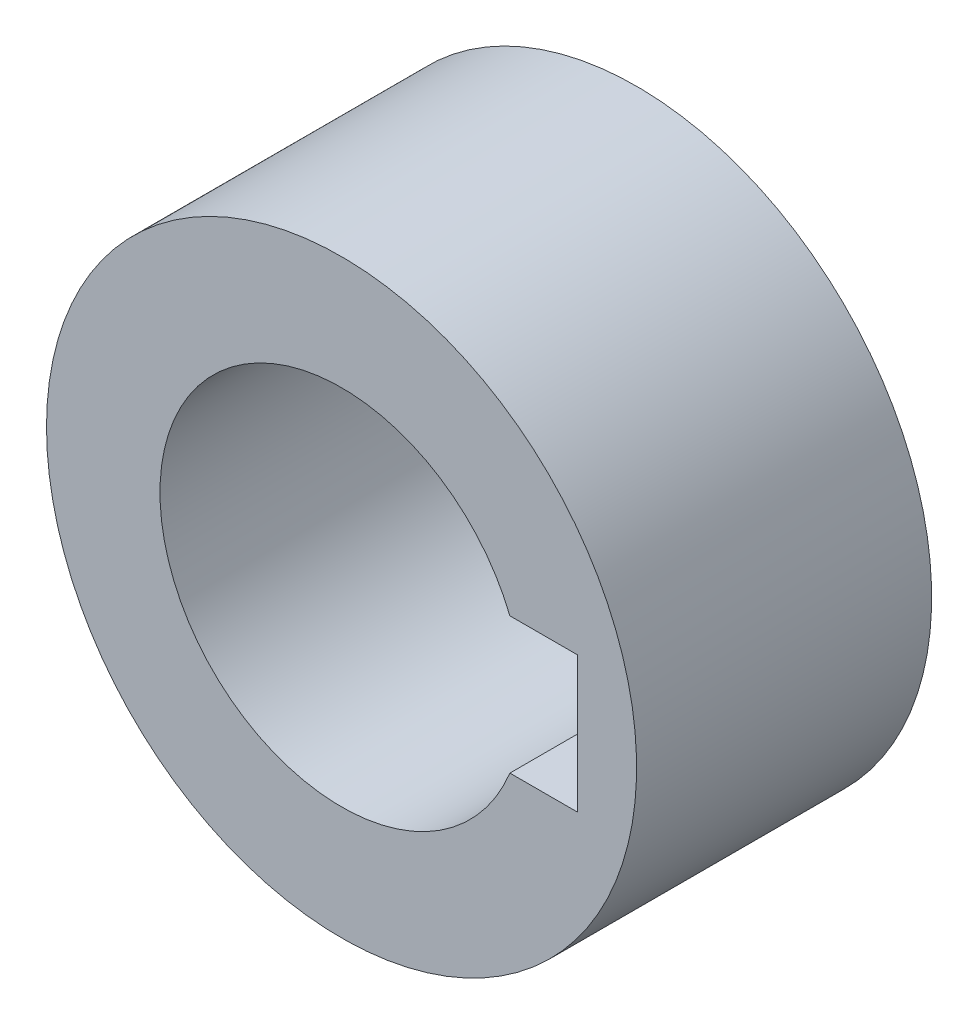
ISO-10303-21;
HEADER;
FILE_DESCRIPTION(('STEP AP214'),'2;1');
FILE_NAME('part.step','',(''),(''),'','','');
FILE_SCHEMA(('AUTOMOTIVE_DESIGN { 1 0 10303 214 1 1 1 1 }'));
ENDSEC;
DATA;
#1=APPLICATION_CONTEXT('core data for automotive mechanical design processes');
#2=APPLICATION_PROTOCOL_DEFINITION('international standard','automotive_design',2000,#1);
#3=PRODUCT_CONTEXT('',#1,'mechanical');
#4=PRODUCT('Part','Part','',(#3));
#5=PRODUCT_RELATED_PRODUCT_CATEGORY('part','',(#4));
#6=PRODUCT_DEFINITION_FORMATION('','',#4);
#7=PRODUCT_DEFINITION_CONTEXT('part definition',#1,'design');
#8=PRODUCT_DEFINITION('design','',#6,#7);
#9=PRODUCT_DEFINITION_SHAPE('','',#8);
#10=(LENGTH_UNIT() NAMED_UNIT(*) SI_UNIT(.MILLI.,.METRE.));
#11=(NAMED_UNIT(*) PLANE_ANGLE_UNIT() SI_UNIT($,.RADIAN.));
#12=(NAMED_UNIT(*) SI_UNIT($,.STERADIAN.) SOLID_ANGLE_UNIT());
#13=UNCERTAINTY_MEASURE_WITH_UNIT(LENGTH_MEASURE(1.E-05),#10,'distance_accuracy_value','');
#14=(GEOMETRIC_REPRESENTATION_CONTEXT(3) GLOBAL_UNCERTAINTY_ASSIGNED_CONTEXT((#13)) GLOBAL_UNIT_ASSIGNED_CONTEXT((#10,
#11,#12)) REPRESENTATION_CONTEXT('',''));
#15=CARTESIAN_POINT('',(0.,0.,0.));
#16=DIRECTION('',(0.,0.,1.));
#17=DIRECTION('',(1.,0.,0.));
#18=AXIS2_PLACEMENT_3D('',#15,#16,#17);
#19=CARTESIAN_POINT('',(0.,0.,6.5));
#20=DIRECTION('',(0.,0.,-1.));
#21=DIRECTION('',(-1.,0.,0.));
#22=AXIS2_PLACEMENT_3D('',#19,#20,#21);
#23=CYLINDRICAL_SURFACE('',#22,4.);
#24=CARTESIAN_POINT('',(0.,0.,0.));
#25=DIRECTION('',(0.,0.,1.));
#26=DIRECTION('',(1.,0.,0.));
#27=AXIS2_PLACEMENT_3D('',#24,#25,#26);
#28=CIRCLE('',#27,4.);
#29=CARTESIAN_POINT('',(3.70809924354783,1.5,0.));
#30=VERTEX_POINT('',#29);
#31=CARTESIAN_POINT('',(3.70809924354783,-1.5,0.));
#32=VERTEX_POINT('',#31);
#33=EDGE_CURVE('E108',#30,#32,#28,.T.);
#34=ORIENTED_EDGE('',*,*,#33,.F.);
#35=DIRECTION('',(0.,0.,-1.));
#36=VECTOR('',#35,1.);
#37=CARTESIAN_POINT('',(3.70809924354783,1.5,6.5));
#38=LINE('',#37,#36);
#39=CARTESIAN_POINT('',(3.70809924354783,1.5,6.5));
#40=VERTEX_POINT('',#39);
#41=EDGE_CURVE('E11',#40,#30,#38,.T.);
#42=ORIENTED_EDGE('',*,*,#41,.F.);
#43=CARTESIAN_POINT('',(0.,0.,6.5));
#44=DIRECTION('',(0.,0.,1.));
#45=DIRECTION('',(1.,0.,0.));
#46=AXIS2_PLACEMENT_3D('',#43,#44,#45);
#47=CIRCLE('',#46,4.);
#48=CARTESIAN_POINT('',(3.70809924354783,-1.5,6.5));
#49=VERTEX_POINT('',#48);
#50=EDGE_CURVE('E90',#40,#49,#47,.T.);
#51=ORIENTED_EDGE('',*,*,#50,.T.);
#52=DIRECTION('',(0.,0.,-1.));
#53=VECTOR('',#52,1.);
#54=CARTESIAN_POINT('',(3.70809924354783,-1.5,6.5));
#55=LINE('',#54,#53);
#56=EDGE_CURVE('E57',#49,#32,#55,.T.);
#57=ORIENTED_EDGE('',*,*,#56,.T.);
#58=EDGE_LOOP('',(#34,#42,#51,#57));
#59=FACE_BOUND('',#58,.T.);
#60=ADVANCED_FACE('F41',(#59),#23,.F.);
#61=CARTESIAN_POINT('',(0.,1.5,6.5));
#62=DIRECTION('',(0.,1.,0.));
#63=DIRECTION('',(0.,0.,1.));
#64=AXIS2_PLACEMENT_3D('',#61,#62,#63);
#65=PLANE('',#64);
#66=DIRECTION('',(1.,0.,0.));
#67=VECTOR('',#66,1.);
#68=CARTESIAN_POINT('',(0.,1.5,0.));
#69=LINE('',#68,#67);
#70=CARTESIAN_POINT('',(5.2,1.5,0.));
#71=VERTEX_POINT('',#70);
#72=EDGE_CURVE('E96',#30,#71,#69,.T.);
#73=ORIENTED_EDGE('',*,*,#72,.T.);
#74=DIRECTION('',(0.,0.,-1.));
#75=VECTOR('',#74,1.);
#76=CARTESIAN_POINT('',(5.2,1.5,6.5));
#77=LINE('',#76,#75);
#78=CARTESIAN_POINT('',(5.2,1.5,6.5));
#79=VERTEX_POINT('',#78);
#80=EDGE_CURVE('E49',#79,#71,#77,.T.);
#81=ORIENTED_EDGE('',*,*,#80,.F.);
#82=DIRECTION('',(1.,0.,0.));
#83=VECTOR('',#82,1.);
#84=CARTESIAN_POINT('',(0.,1.5,6.5));
#85=LINE('',#84,#83);
#86=EDGE_CURVE('E83',#40,#79,#85,.T.);
#87=ORIENTED_EDGE('',*,*,#86,.F.);
#88=ORIENTED_EDGE('',*,*,#41,.T.);
#89=EDGE_LOOP('',(#73,#81,#87,#88));
#90=FACE_BOUND('',#89,.T.);
#91=ADVANCED_FACE('F94',(#90),#65,.F.);
#92=CARTESIAN_POINT('',(5.2,0.,6.5));
#93=DIRECTION('',(-1.,0.,0.));
#94=DIRECTION('',(0.,0.,1.));
#95=AXIS2_PLACEMENT_3D('',#92,#93,#94);
#96=PLANE('',#95);
#97=DIRECTION('',(0.,1.,0.));
#98=VECTOR('',#97,1.);
#99=CARTESIAN_POINT('',(5.2,0.,0.));
#100=LINE('',#99,#98);
#101=CARTESIAN_POINT('',(5.2,-1.5,0.));
#102=VERTEX_POINT('',#101);
#103=EDGE_CURVE('E111',#102,#71,#100,.T.);
#104=ORIENTED_EDGE('',*,*,#103,.F.);
#105=DIRECTION('',(0.,0.,-1.));
#106=VECTOR('',#105,1.);
#107=CARTESIAN_POINT('',(5.2,-1.5,6.5));
#108=LINE('',#107,#106);
#109=CARTESIAN_POINT('',(5.2,-1.5,6.5));
#110=VERTEX_POINT('',#109);
#111=EDGE_CURVE('E70',#110,#102,#108,.T.);
#112=ORIENTED_EDGE('',*,*,#111,.F.);
#113=DIRECTION('',(0.,1.,0.));
#114=VECTOR('',#113,1.);
#115=CARTESIAN_POINT('',(5.2,0.,6.5));
#116=LINE('',#115,#114);
#117=EDGE_CURVE('E89',#110,#79,#116,.T.);
#118=ORIENTED_EDGE('',*,*,#117,.T.);
#119=ORIENTED_EDGE('',*,*,#80,.T.);
#120=EDGE_LOOP('',(#104,#112,#118,#119));
#121=FACE_BOUND('',#120,.T.);
#122=ADVANCED_FACE('F99',(#121),#96,.T.);
#123=CARTESIAN_POINT('',(0.,-1.5,6.5));
#124=DIRECTION('',(0.,1.,0.));
#125=DIRECTION('',(-1.,0.,0.));
#126=AXIS2_PLACEMENT_3D('',#123,#124,#125);
#127=PLANE('',#126);
#128=DIRECTION('',(1.,0.,0.));
#129=VECTOR('',#128,1.);
#130=CARTESIAN_POINT('',(0.,-1.5,0.));
#131=LINE('',#130,#129);
#132=EDGE_CURVE('E113',#32,#102,#131,.T.);
#133=ORIENTED_EDGE('',*,*,#132,.F.);
#134=ORIENTED_EDGE('',*,*,#56,.F.);
#135=DIRECTION('',(1.,0.,0.));
#136=VECTOR('',#135,1.);
#137=CARTESIAN_POINT('',(0.,-1.5,6.5));
#138=LINE('',#137,#136);
#139=EDGE_CURVE('E100',#49,#110,#138,.T.);
#140=ORIENTED_EDGE('',*,*,#139,.T.);
#141=ORIENTED_EDGE('',*,*,#111,.T.);
#142=EDGE_LOOP('',(#133,#134,#140,#141));
#143=FACE_BOUND('',#142,.T.);
#144=ADVANCED_FACE('F122',(#143),#127,.T.);
#145=CARTESIAN_POINT('',(0.,0.,6.5));
#146=DIRECTION('',(0.,0.,-1.));
#147=DIRECTION('',(-1.,0.,0.));
#148=AXIS2_PLACEMENT_3D('',#145,#146,#147);
#149=CYLINDRICAL_SURFACE('',#148,6.5);
#150=CARTESIAN_POINT('',(0.,0.,6.5));
#151=DIRECTION('',(0.,0.,1.));
#152=DIRECTION('',(1.,0.,0.));
#153=AXIS2_PLACEMENT_3D('',#150,#151,#152);
#154=CIRCLE('',#153,6.5);
#155=CARTESIAN_POINT('',(-6.5,0.,6.5));
#156=VERTEX_POINT('',#155);
#157=EDGE_CURVE('E102',#156,#156,#154,.T.);
#158=CARTESIAN_POINT('',(0.,0.,0.));
#159=DIRECTION('',(0.,0.,1.));
#160=DIRECTION('',(1.,0.,0.));
#161=AXIS2_PLACEMENT_3D('',#158,#159,#160);
#162=CIRCLE('',#161,6.5);
#163=CARTESIAN_POINT('',(-6.5,0.,0.));
#164=VERTEX_POINT('',#163);
#165=EDGE_CURVE('E116',#164,#164,#162,.T.);
#166=CARTESIAN_POINT('',(-6.5,0.,6.5));
#167=CARTESIAN_POINT('',(-6.5,0.,6.43229166666667));
#168=CARTESIAN_POINT('',(-6.5,0.,6.36458333333333));
#169=CARTESIAN_POINT('',(-6.5,0.,6.22916666666667));
#170=CARTESIAN_POINT('',(-6.5,0.,6.16145833333333));
#171=CARTESIAN_POINT('',(-6.5,0.,6.02604166666667));
#172=CARTESIAN_POINT('',(-6.5,0.,5.95833333333333));
#173=CARTESIAN_POINT('',(-6.5,0.,5.82291666666667));
#174=CARTESIAN_POINT('',(-6.5,0.,5.75520833333333));
#175=CARTESIAN_POINT('',(-6.5,0.,5.61979166666667));
#176=CARTESIAN_POINT('',(-6.5,0.,5.55208333333333));
#177=CARTESIAN_POINT('',(-6.5,0.,5.41666666666667));
#178=CARTESIAN_POINT('',(-6.5,0.,5.34895833333333));
#179=CARTESIAN_POINT('',(-6.5,0.,5.21354166666667));
#180=CARTESIAN_POINT('',(-6.5,0.,5.14583333333333));
#181=CARTESIAN_POINT('',(-6.5,0.,5.01041666666667));
#182=CARTESIAN_POINT('',(-6.5,0.,4.94270833333333));
#183=CARTESIAN_POINT('',(-6.5,0.,4.80729166666667));
#184=CARTESIAN_POINT('',(-6.5,0.,4.73958333333333));
#185=CARTESIAN_POINT('',(-6.5,0.,4.60416666666667));
#186=CARTESIAN_POINT('',(-6.5,0.,4.53645833333333));
#187=CARTESIAN_POINT('',(-6.5,0.,4.40104166666667));
#188=CARTESIAN_POINT('',(-6.5,0.,4.33333333333333));
#189=CARTESIAN_POINT('',(-6.5,0.,4.19791666666667));
#190=CARTESIAN_POINT('',(-6.5,0.,4.13020833333333));
#191=CARTESIAN_POINT('',(-6.5,0.,3.99479166666667));
#192=CARTESIAN_POINT('',(-6.5,0.,3.92708333333333));
#193=CARTESIAN_POINT('',(-6.5,0.,3.79166666666667));
#194=CARTESIAN_POINT('',(-6.5,0.,3.72395833333333));
#195=CARTESIAN_POINT('',(-6.5,0.,3.58854166666667));
#196=CARTESIAN_POINT('',(-6.5,0.,3.52083333333333));
#197=CARTESIAN_POINT('',(-6.5,0.,3.38541666666667));
#198=CARTESIAN_POINT('',(-6.5,0.,3.31770833333333));
#199=CARTESIAN_POINT('',(-6.5,0.,3.18229166666667));
#200=CARTESIAN_POINT('',(-6.5,0.,3.11458333333333));
#201=CARTESIAN_POINT('',(-6.5,0.,2.97916666666667));
#202=CARTESIAN_POINT('',(-6.5,0.,2.91145833333333));
#203=CARTESIAN_POINT('',(-6.5,0.,2.77604166666667));
#204=CARTESIAN_POINT('',(-6.5,0.,2.70833333333333));
#205=CARTESIAN_POINT('',(-6.5,0.,2.57291666666667));
#206=CARTESIAN_POINT('',(-6.5,0.,2.50520833333333));
#207=CARTESIAN_POINT('',(-6.5,0.,2.36979166666667));
#208=CARTESIAN_POINT('',(-6.5,0.,2.30208333333333));
#209=CARTESIAN_POINT('',(-6.5,0.,2.16666666666667));
#210=CARTESIAN_POINT('',(-6.5,0.,2.09895833333333));
#211=CARTESIAN_POINT('',(-6.5,0.,1.96354166666667));
#212=CARTESIAN_POINT('',(-6.5,0.,1.89583333333333));
#213=CARTESIAN_POINT('',(-6.5,0.,1.76041666666667));
#214=CARTESIAN_POINT('',(-6.5,0.,1.69270833333333));
#215=CARTESIAN_POINT('',(-6.5,0.,1.55729166666667));
#216=CARTESIAN_POINT('',(-6.5,0.,1.48958333333333));
#217=CARTESIAN_POINT('',(-6.5,0.,1.35416666666667));
#218=CARTESIAN_POINT('',(-6.5,0.,1.28645833333333));
#219=CARTESIAN_POINT('',(-6.5,0.,1.15104166666667));
#220=CARTESIAN_POINT('',(-6.5,0.,1.08333333333333));
#221=CARTESIAN_POINT('',(-6.5,0.,0.947916666666667));
#222=CARTESIAN_POINT('',(-6.5,0.,0.880208333333333));
#223=CARTESIAN_POINT('',(-6.5,0.,0.744791666666667));
#224=CARTESIAN_POINT('',(-6.5,0.,0.677083333333333));
#225=CARTESIAN_POINT('',(-6.5,0.,0.541666666666667));
#226=CARTESIAN_POINT('',(-6.5,0.,0.473958333333333));
#227=CARTESIAN_POINT('',(-6.5,0.,0.338541666666667));
#228=CARTESIAN_POINT('',(-6.5,0.,0.270833333333334));
#229=CARTESIAN_POINT('',(-6.5,0.,0.135416666666667));
#230=CARTESIAN_POINT('',(-6.5,0.,0.0677083333333334));
#231=CARTESIAN_POINT('',(-6.5,0.,0.));
#232=B_SPLINE_CURVE_WITH_KNOTS('',3,(#166,#167,#168,#169,#170,#171,#172,#173,#174,#175,#176,
#177,#178,#179,#180,#181,#182,#183,#184,#185,#186,#187,#188,#189,#190,#191,#192,#193,#194,#195,
#196,#197,#198,#199,#200,#201,#202,#203,#204,#205,#206,#207,#208,#209,#210,#211,#212,#213,#214,
#215,#216,#217,#218,#219,#220,#221,#222,#223,#224,#225,#226,#227,#228,#229,#230,#231),
.UNSPECIFIED.,.F.,.F.,(4,2,2,2,2,2,2,2,2,2,2,2,2,2,2,2,2,2,2,2,2,2,2,2,2,2,2,2,2,2,2,2,4),(0.,
0.203124999999999,0.40625,0.609375,0.812499999999999,1.015625,1.21875,1.421875,1.625,1.828125,
2.03125,2.234375,2.4375,2.640625,2.84375,3.046875,3.25,3.453125,3.65625,3.859375,4.0625,
4.265625,4.46875,4.671875,4.875,5.078125,5.28125,5.484375,5.6875,5.890625,6.09375,6.296875,6.5),.UNSPECIFIED.);
#233=EDGE_CURVE('BSEAM124',#156,#164,#232,.T.);
#234=ORIENTED_EDGE('',*,*,#157,.F.);
#235=ORIENTED_EDGE('',*,*,#165,.T.);
#236=ORIENTED_EDGE('',*,*,#233,.T.);
#237=ORIENTED_EDGE('',*,*,#233,.F.);
#238=EDGE_LOOP('',(#234,#236,#235,#237));
#239=FACE_BOUND('',#238,.T.);
#240=ADVANCED_FACE('F124',(#239),#149,.T.);
#241=CARTESIAN_POINT('',(0.,0.,6.5));
#242=DIRECTION('',(0.,0.,1.));
#243=DIRECTION('',(1.,0.,0.));
#244=AXIS2_PLACEMENT_3D('',#241,#242,#243);
#245=PLANE('',#244);
#246=ORIENTED_EDGE('',*,*,#50,.F.);
#247=ORIENTED_EDGE('',*,*,#86,.T.);
#248=ORIENTED_EDGE('',*,*,#117,.F.);
#249=ORIENTED_EDGE('',*,*,#139,.F.);
#250=EDGE_LOOP('',(#246,#247,#248,#249));
#251=FACE_BOUND('',#250,.T.);
#252=ORIENTED_EDGE('',*,*,#157,.T.);
#253=EDGE_LOOP('',(#252));
#254=FACE_BOUND('',#253,.T.);
#255=ADVANCED_FACE('F85',(#251,#254),#245,.T.);
#256=CARTESIAN_POINT('',(0.,0.,0.));
#257=DIRECTION('',(0.,0.,1.));
#258=DIRECTION('',(1.,0.,0.));
#259=AXIS2_PLACEMENT_3D('',#256,#257,#258);
#260=PLANE('',#259);
#261=ORIENTED_EDGE('',*,*,#33,.T.);
#262=ORIENTED_EDGE('',*,*,#132,.T.);
#263=ORIENTED_EDGE('',*,*,#103,.T.);
#264=ORIENTED_EDGE('',*,*,#72,.F.);
#265=EDGE_LOOP('',(#261,#262,#263,#264));
#266=FACE_BOUND('',#265,.T.);
#267=ORIENTED_EDGE('',*,*,#165,.F.);
#268=EDGE_LOOP('',(#267));
#269=FACE_BOUND('',#268,.T.);
#270=ADVANCED_FACE('F164',(#266,#269),#260,.F.);
#271=CLOSED_SHELL('',(#60,#91,#122,#144,#240,#255,#270));
#272=MANIFOLD_SOLID_BREP('B2',#271);
#273=ADVANCED_BREP_SHAPE_REPRESENTATION('',(#18,#272),#14);
#274=SHAPE_DEFINITION_REPRESENTATION(#9,#273);
ENDSEC;
END-ISO-10303-21;
